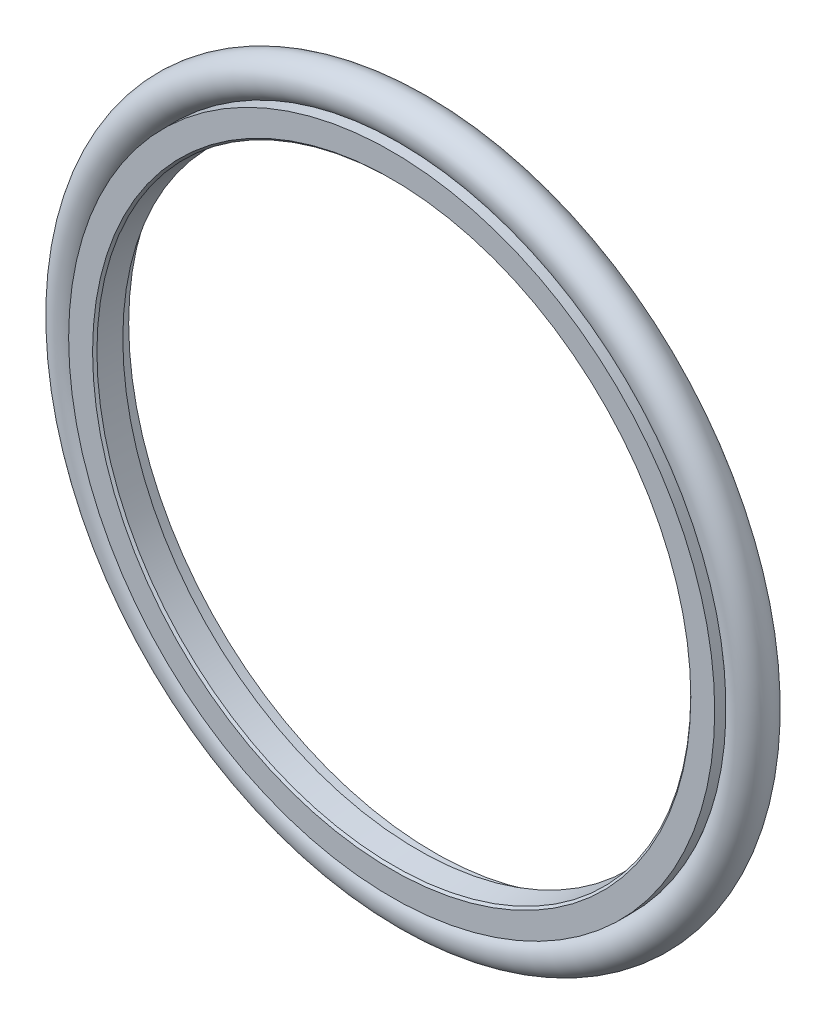
ISO-10303-21;
HEADER;
FILE_DESCRIPTION(('STEP AP214'),'2;1');
FILE_NAME('part.step','',(''),(''),'','','');
FILE_SCHEMA(('AUTOMOTIVE_DESIGN { 1 0 10303 214 1 1 1 1 }'));
ENDSEC;
DATA;
#1=APPLICATION_CONTEXT('core data for automotive mechanical design processes');
#2=APPLICATION_PROTOCOL_DEFINITION('international standard','automotive_design',2000,#1);
#3=PRODUCT_CONTEXT('',#1,'mechanical');
#4=PRODUCT('Part','Part','',(#3));
#5=PRODUCT_RELATED_PRODUCT_CATEGORY('part','',(#4));
#6=PRODUCT_DEFINITION_FORMATION('','',#4);
#7=PRODUCT_DEFINITION_CONTEXT('part definition',#1,'design');
#8=PRODUCT_DEFINITION('design','',#6,#7);
#9=PRODUCT_DEFINITION_SHAPE('','',#8);
#10=(LENGTH_UNIT() NAMED_UNIT(*) SI_UNIT(.MILLI.,.METRE.));
#11=(NAMED_UNIT(*) PLANE_ANGLE_UNIT() SI_UNIT($,.RADIAN.));
#12=(NAMED_UNIT(*) SI_UNIT($,.STERADIAN.) SOLID_ANGLE_UNIT());
#13=UNCERTAINTY_MEASURE_WITH_UNIT(LENGTH_MEASURE(1.E-05),#10,'distance_accuracy_value','');
#14=(GEOMETRIC_REPRESENTATION_CONTEXT(3) GLOBAL_UNCERTAINTY_ASSIGNED_CONTEXT((#13)) GLOBAL_UNIT_ASSIGNED_CONTEXT((#10,
#11,#12)) REPRESENTATION_CONTEXT('',''));
#15=CARTESIAN_POINT('',(0.,0.,0.));
#16=DIRECTION('',(0.,0.,1.));
#17=DIRECTION('',(1.,0.,0.));
#18=AXIS2_PLACEMENT_3D('',#15,#16,#17);
#19=CARTESIAN_POINT('',(0.,0.,1.96));
#20=DIRECTION('',(0.,0.,-1.));
#21=DIRECTION('',(0.,1.,0.));
#22=AXIS2_PLACEMENT_3D('',#19,#20,#21);
#23=TOROIDAL_SURFACE('',#22,31.265,1.765);
#24=CARTESIAN_POINT('',(0.,33.03,1.96));
#25=VERTEX_POINT('',#24);
#26=VERTEX_LOOP('',#25);
#27=FACE_BOUND('',#26,.T.);
#28=ADVANCED_FACE('F50',(#27),#23,.T.);
#29=CLOSED_SHELL('',(#28));
#30=MANIFOLD_SOLID_BREP('B2',#29);
#31=CARTESIAN_POINT('',(0.,0.,0.));
#32=DIRECTION('',(0.,0.,-1.));
#33=DIRECTION('',(-1.,0.,0.));
#34=AXIS2_PLACEMENT_3D('',#31,#32,#33);
#35=CYLINDRICAL_SURFACE('',#34,28.1);
#36=CARTESIAN_POINT('',(0.,0.,0.));
#37=DIRECTION('',(0.,0.,-1.));
#38=DIRECTION('',(-1.,0.,0.));
#39=AXIS2_PLACEMENT_3D('',#36,#37,#38);
#40=CIRCLE('',#39,28.1);
#41=CARTESIAN_POINT('',(-28.1,0.,0.));
#42=VERTEX_POINT('',#41);
#43=EDGE_CURVE('E49',#42,#42,#40,.T.);
#44=ORIENTED_EDGE('',*,*,#43,.T.);
#45=EDGE_LOOP('',(#44));
#46=FACE_BOUND('',#45,.T.);
#47=CARTESIAN_POINT('',(0.,0.,0.9));
#48=DIRECTION('',(0.,0.,-1.));
#49=DIRECTION('',(-1.,0.,0.));
#50=AXIS2_PLACEMENT_3D('',#47,#48,#49);
#51=CIRCLE('',#50,28.1);
#52=CARTESIAN_POINT('',(-28.1,0.,0.9));
#53=VERTEX_POINT('',#52);
#54=EDGE_CURVE('E91',#53,#53,#51,.T.);
#55=ORIENTED_EDGE('',*,*,#54,.F.);
#56=EDGE_LOOP('',(#55));
#57=FACE_BOUND('',#56,.T.);
#58=ADVANCED_FACE('F66',(#46,#57),#35,.F.);
#59=CARTESIAN_POINT('',(0.,28.1,0.));
#60=DIRECTION('',(0.,0.,-1.));
#61=DIRECTION('',(-1.,0.,0.));
#62=AXIS2_PLACEMENT_3D('',#59,#60,#61);
#63=PLANE('',#62);
#64=CARTESIAN_POINT('',(0.,0.,0.));
#65=DIRECTION('',(0.,0.,-1.));
#66=DIRECTION('',(-1.,0.,0.));
#67=AXIS2_PLACEMENT_3D('',#64,#65,#66);
#68=CIRCLE('',#67,29.7);
#69=CARTESIAN_POINT('',(-29.7,0.,0.));
#70=VERTEX_POINT('',#69);
#71=EDGE_CURVE('E72',#70,#70,#68,.T.);
#72=ORIENTED_EDGE('',*,*,#71,.T.);
#73=EDGE_LOOP('',(#72));
#74=FACE_BOUND('',#73,.T.);
#75=ORIENTED_EDGE('',*,*,#43,.F.);
#76=EDGE_LOOP('',(#75));
#77=FACE_BOUND('',#76,.T.);
#78=ADVANCED_FACE('F99',(#74,#77),#63,.T.);
#79=CARTESIAN_POINT('',(0.,0.,0.));
#80=DIRECTION('',(0.,0.,-1.));
#81=DIRECTION('',(-1.,0.,0.));
#82=AXIS2_PLACEMENT_3D('',#79,#80,#81);
#83=CYLINDRICAL_SURFACE('',#82,29.7);
#84=CARTESIAN_POINT('',(0.,0.,3.92));
#85=DIRECTION('',(0.,0.,-1.));
#86=DIRECTION('',(-1.,0.,0.));
#87=AXIS2_PLACEMENT_3D('',#84,#85,#86);
#88=CIRCLE('',#87,29.7);
#89=CARTESIAN_POINT('',(-29.7,0.,3.92));
#90=VERTEX_POINT('',#89);
#91=EDGE_CURVE('E76',#90,#90,#88,.T.);
#92=ORIENTED_EDGE('',*,*,#91,.T.);
#93=EDGE_LOOP('',(#92));
#94=FACE_BOUND('',#93,.T.);
#95=ORIENTED_EDGE('',*,*,#71,.F.);
#96=EDGE_LOOP('',(#95));
#97=FACE_BOUND('',#96,.T.);
#98=ADVANCED_FACE('F103',(#94,#97),#83,.T.);
#99=CARTESIAN_POINT('',(0.,29.7,3.92));
#100=DIRECTION('',(0.,0.,1.));
#101=DIRECTION('',(1.,0.,0.));
#102=AXIS2_PLACEMENT_3D('',#99,#100,#101);
#103=PLANE('',#102);
#104=CARTESIAN_POINT('',(0.,0.,3.92));
#105=DIRECTION('',(0.,0.,-1.));
#106=DIRECTION('',(-1.,0.,0.));
#107=AXIS2_PLACEMENT_3D('',#104,#105,#106);
#108=CIRCLE('',#107,27.5);
#109=CARTESIAN_POINT('',(-27.5,0.,3.92));
#110=VERTEX_POINT('',#109);
#111=EDGE_CURVE('E80',#110,#110,#108,.T.);
#112=ORIENTED_EDGE('',*,*,#111,.T.);
#113=EDGE_LOOP('',(#112));
#114=FACE_BOUND('',#113,.T.);
#115=ORIENTED_EDGE('',*,*,#91,.F.);
#116=EDGE_LOOP('',(#115));
#117=FACE_BOUND('',#116,.T.);
#118=ADVANCED_FACE('F107',(#114,#117),#103,.T.);
#119=CARTESIAN_POINT('',(0.,0.,3.92));
#120=DIRECTION('',(0.,0.,1.));
#121=DIRECTION('',(1.,0.,0.));
#122=AXIS2_PLACEMENT_3D('',#119,#120,#121);
#123=CONICAL_SURFACE('',#122,27.5,0.785398163397444);
#124=CARTESIAN_POINT('',(0.,0.,3.72));
#125=DIRECTION('',(0.,0.,-1.));
#126=DIRECTION('',(-1.,0.,0.));
#127=AXIS2_PLACEMENT_3D('',#124,#125,#126);
#128=CIRCLE('',#127,27.3);
#129=CARTESIAN_POINT('',(-27.3,0.,3.72));
#130=VERTEX_POINT('',#129);
#131=EDGE_CURVE('E85',#130,#130,#128,.T.);
#132=ORIENTED_EDGE('',*,*,#131,.T.);
#133=EDGE_LOOP('',(#132));
#134=FACE_BOUND('',#133,.T.);
#135=ORIENTED_EDGE('',*,*,#111,.F.);
#136=EDGE_LOOP('',(#135));
#137=FACE_BOUND('',#136,.T.);
#138=ADVANCED_FACE('F114',(#134,#137),#123,.F.);
#139=CARTESIAN_POINT('',(0.,0.,3.72));
#140=DIRECTION('',(0.,0.,1.));
#141=DIRECTION('',(1.,0.,0.));
#142=AXIS2_PLACEMENT_3D('',#139,#140,#141);
#143=CONICAL_SURFACE('',#142,27.3,0.0719476695633823);
#144=CARTESIAN_POINT('',(0.,0.,1.5));
#145=DIRECTION('',(0.,0.,-1.));
#146=DIRECTION('',(-1.,0.,0.));
#147=AXIS2_PLACEMENT_3D('',#144,#145,#146);
#148=CIRCLE('',#147,27.14);
#149=CARTESIAN_POINT('',(-27.14,0.,1.5));
#150=VERTEX_POINT('',#149);
#151=EDGE_CURVE('E88',#150,#150,#148,.T.);
#152=ORIENTED_EDGE('',*,*,#151,.T.);
#153=EDGE_LOOP('',(#152));
#154=FACE_BOUND('',#153,.T.);
#155=ORIENTED_EDGE('',*,*,#131,.F.);
#156=EDGE_LOOP('',(#155));
#157=FACE_BOUND('',#156,.T.);
#158=ADVANCED_FACE('F118',(#154,#157),#143,.F.);
#159=CARTESIAN_POINT('',(0.,0.,1.5));
#160=DIRECTION('',(0.,0.,-1.));
#161=DIRECTION('',(-1.,0.,0.));
#162=AXIS2_PLACEMENT_3D('',#159,#160,#161);
#163=CONICAL_SURFACE('',#162,27.14,1.01219701145133);
#164=ORIENTED_EDGE('',*,*,#54,.T.);
#165=EDGE_LOOP('',(#164));
#166=FACE_BOUND('',#165,.T.);
#167=ORIENTED_EDGE('',*,*,#151,.F.);
#168=EDGE_LOOP('',(#167));
#169=FACE_BOUND('',#168,.T.);
#170=ADVANCED_FACE('F95',(#166,#169),#163,.F.);
#171=CLOSED_SHELL('',(#58,#78,#98,#118,#138,#158,#170));
#172=MANIFOLD_SOLID_BREP('B6',#171);
#173=ADVANCED_BREP_SHAPE_REPRESENTATION('',(#18,#30,#172),#14);
#174=SHAPE_DEFINITION_REPRESENTATION(#9,#173);
ENDSEC;
END-ISO-10303-21;
